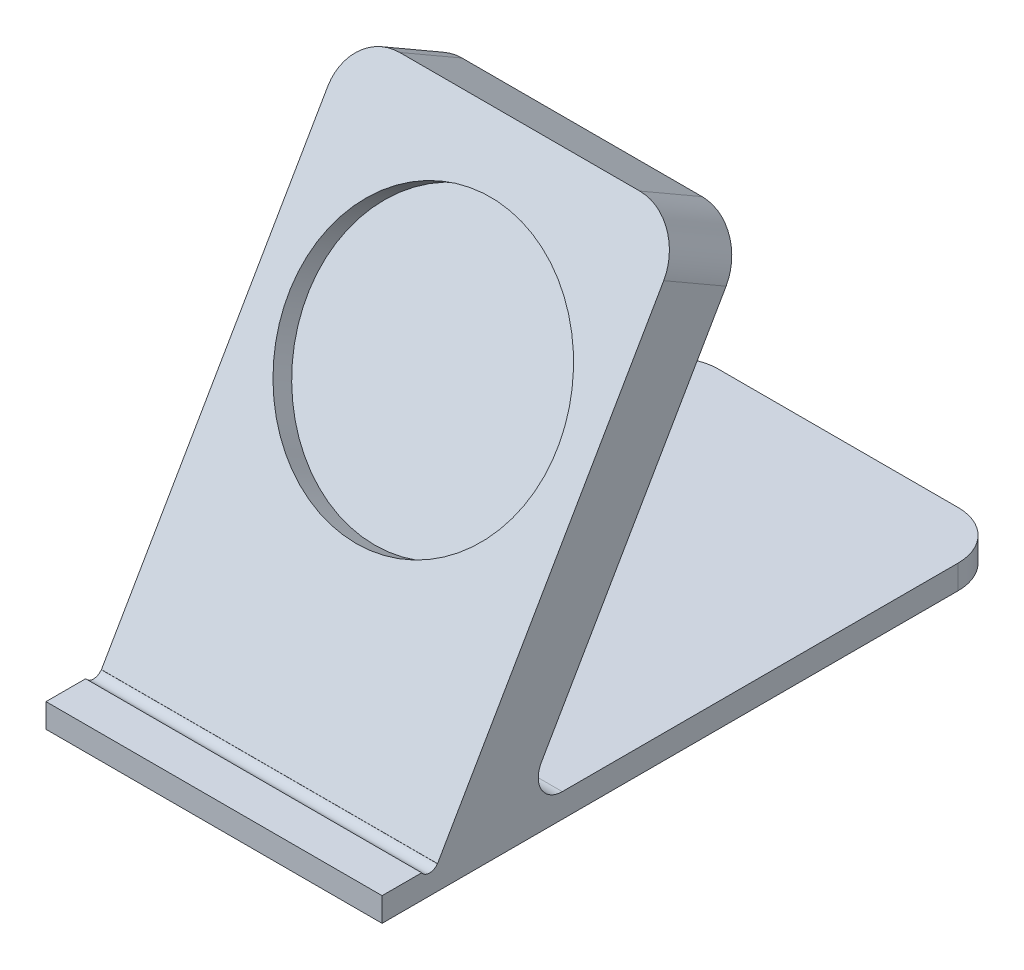
ISO-10303-21;
HEADER;
FILE_DESCRIPTION(('STEP AP214'),'2;1');
FILE_NAME('part.step','',(''),(''),'','','');
FILE_SCHEMA(('AUTOMOTIVE_DESIGN { 1 0 10303 214 1 1 1 1 }'));
ENDSEC;
DATA;
#1=APPLICATION_CONTEXT('core data for automotive mechanical design processes');
#2=APPLICATION_PROTOCOL_DEFINITION('international standard','automotive_design',2000,#1);
#3=PRODUCT_CONTEXT('',#1,'mechanical');
#4=PRODUCT('Part','Part','',(#3));
#5=PRODUCT_RELATED_PRODUCT_CATEGORY('part','',(#4));
#6=PRODUCT_DEFINITION_FORMATION('','',#4);
#7=PRODUCT_DEFINITION_CONTEXT('part definition',#1,'design');
#8=PRODUCT_DEFINITION('design','',#6,#7);
#9=PRODUCT_DEFINITION_SHAPE('','',#8);
#10=(LENGTH_UNIT() NAMED_UNIT(*) SI_UNIT(.MILLI.,.METRE.));
#11=(NAMED_UNIT(*) PLANE_ANGLE_UNIT() SI_UNIT($,.RADIAN.));
#12=(NAMED_UNIT(*) SI_UNIT($,.STERADIAN.) SOLID_ANGLE_UNIT());
#13=UNCERTAINTY_MEASURE_WITH_UNIT(LENGTH_MEASURE(1.E-05),#10,'distance_accuracy_value','');
#14=(GEOMETRIC_REPRESENTATION_CONTEXT(3) GLOBAL_UNCERTAINTY_ASSIGNED_CONTEXT((#13)) GLOBAL_UNIT_ASSIGNED_CONTEXT((#10,
#11,#12)) REPRESENTATION_CONTEXT('',''));
#15=CARTESIAN_POINT('',(0.,0.,0.));
#16=DIRECTION('',(0.,0.,1.));
#17=DIRECTION('',(1.,0.,0.));
#18=AXIS2_PLACEMENT_3D('',#15,#16,#17);
#19=CARTESIAN_POINT('',(-25.,5.,-55.));
#20=DIRECTION('',(0.,1.,0.));
#21=DIRECTION('',(0.,0.,1.));
#22=AXIS2_PLACEMENT_3D('',#19,#20,#21);
#23=PLANE('',#22);
#24=DIRECTION('',(0.,0.,1.));
#25=VECTOR('',#24,1.);
#26=CARTESIAN_POINT('',(-35.,5.,-55.));
#27=LINE('',#26,#25);
#28=CARTESIAN_POINT('',(-35.,5.,-55.));
#29=VERTEX_POINT('',#28);
#30=CARTESIAN_POINT('',(-35.,5.,27.4722325026744));
#31=VERTEX_POINT('',#30);
#32=EDGE_CURVE('E58',#29,#31,#27,.T.);
#33=ORIENTED_EDGE('',*,*,#32,.T.);
#34=DIRECTION('',(1.,0.,0.));
#35=VECTOR('',#34,1.);
#36=CARTESIAN_POINT('',(-46.4564392373896,5.,27.4722325026744));
#37=LINE('',#36,#35);
#38=CARTESIAN_POINT('',(35.,5.,27.4722325026744));
#39=VERTEX_POINT('',#38);
#40=EDGE_CURVE('E53',#31,#39,#37,.T.);
#41=ORIENTED_EDGE('',*,*,#40,.T.);
#42=DIRECTION('',(0.,0.,-1.));
#43=VECTOR('',#42,1.);
#44=CARTESIAN_POINT('',(35.,5.,-55.));
#45=LINE('',#44,#43);
#46=CARTESIAN_POINT('',(35.,5.,-55.));
#47=VERTEX_POINT('',#46);
#48=EDGE_CURVE('E213',#39,#47,#45,.T.);
#49=ORIENTED_EDGE('',*,*,#48,.T.);
#50=CARTESIAN_POINT('',(25.,5.,-55.));
#51=DIRECTION('',(0.,1.,0.));
#52=DIRECTION('',(0.,0.,-1.));
#53=AXIS2_PLACEMENT_3D('',#50,#51,#52);
#54=CIRCLE('',#53,10.);
#55=CARTESIAN_POINT('',(25.,5.,-65.));
#56=VERTEX_POINT('',#55);
#57=EDGE_CURVE('E211',#47,#56,#54,.T.);
#58=ORIENTED_EDGE('',*,*,#57,.T.);
#59=DIRECTION('',(-1.,0.,0.));
#60=VECTOR('',#59,1.);
#61=CARTESIAN_POINT('',(-25.,5.,-65.));
#62=LINE('',#61,#60);
#63=CARTESIAN_POINT('',(-25.,5.,-65.));
#64=VERTEX_POINT('',#63);
#65=EDGE_CURVE('E215',#56,#64,#62,.T.);
#66=ORIENTED_EDGE('',*,*,#65,.T.);
#67=CARTESIAN_POINT('',(-25.,5.,-55.));
#68=DIRECTION('',(0.,1.,0.));
#69=DIRECTION('',(0.,0.,1.));
#70=AXIS2_PLACEMENT_3D('',#67,#68,#69);
#71=CIRCLE('',#70,10.);
#72=EDGE_CURVE('E217',#64,#29,#71,.T.);
#73=ORIENTED_EDGE('',*,*,#72,.T.);
#74=EDGE_LOOP('',(#33,#41,#49,#58,#66,#73));
#75=FACE_BOUND('',#74,.T.);
#76=ADVANCED_FACE('F38',(#75),#23,.T.);
#77=CARTESIAN_POINT('',(0.,16.8958256229942,29.2644284148502));
#78=DIRECTION('',(0.,0.499999999999998,0.86602540378444));
#79=DIRECTION('',(0.,-0.86602540378444,0.499999999999998));
#80=AXIS2_PLACEMENT_3D('',#77,#78,#79);
#81=PLANE('',#80);
#82=DIRECTION('',(1.,0.,0.));
#83=VECTOR('',#82,1.);
#84=CARTESIAN_POINT('',(-46.4564392373896,12.5,31.8023595215966));
#85=LINE('',#84,#83);
#86=CARTESIAN_POINT('',(-35.,12.5,31.8023595215966));
#87=VERTEX_POINT('',#86);
#88=CARTESIAN_POINT('',(35.,12.5,31.8023595215966));
#89=VERTEX_POINT('',#88);
#90=EDGE_CURVE('E155',#87,#89,#85,.T.);
#91=ORIENTED_EDGE('',*,*,#90,.F.);
#92=DIRECTION('',(0.,0.86602540378444,-0.499999999999998));
#93=VECTOR('',#92,1.);
#94=CARTESIAN_POINT('',(-35.,16.8958256229942,29.2644284148502));
#95=LINE('',#94,#93);
#96=CARTESIAN_POINT('',(-35.,79.102540378444,-6.65063509461082));
#97=VERTEX_POINT('',#96);
#98=EDGE_CURVE('E142',#87,#97,#95,.T.);
#99=ORIENTED_EDGE('',*,*,#98,.T.);
#100=CARTESIAN_POINT('',(-25.,79.102540378444,-6.65063509461082));
#101=DIRECTION('',(0.,0.499999999999998,0.86602540378444));
#102=DIRECTION('',(0.,-0.86602540378444,0.499999999999998));
#103=AXIS2_PLACEMENT_3D('',#100,#101,#102);
#104=CIRCLE('',#103,9.99999999999999);
#105=CARTESIAN_POINT('',(-25.,87.7627944162884,-11.6506350946108));
#106=VERTEX_POINT('',#105);
#107=EDGE_CURVE('E152',#97,#106,#104,.F.);
#108=ORIENTED_EDGE('',*,*,#107,.T.);
#109=DIRECTION('',(1.,0.,0.));
#110=VECTOR('',#109,1.);
#111=CARTESIAN_POINT('',(0.,87.7627944162884,-11.6506350946108));
#112=LINE('',#111,#110);
#113=CARTESIAN_POINT('',(25.,87.7627944162884,-11.6506350946108));
#114=VERTEX_POINT('',#113);
#115=EDGE_CURVE('E180',#106,#114,#112,.T.);
#116=ORIENTED_EDGE('',*,*,#115,.T.);
#117=CARTESIAN_POINT('',(25.,79.102540378444,-6.65063509461082));
#118=DIRECTION('',(0.,0.499999999999998,0.86602540378444));
#119=DIRECTION('',(0.,-0.86602540378444,0.499999999999998));
#120=AXIS2_PLACEMENT_3D('',#117,#118,#119);
#121=CIRCLE('',#120,9.99999999999999);
#122=CARTESIAN_POINT('',(35.,79.102540378444,-6.65063509461082));
#123=VERTEX_POINT('',#122);
#124=EDGE_CURVE('E178',#114,#123,#121,.F.);
#125=ORIENTED_EDGE('',*,*,#124,.T.);
#126=DIRECTION('',(0.,0.86602540378444,-0.499999999999998));
#127=VECTOR('',#126,1.);
#128=CARTESIAN_POINT('',(35.,16.8958256229942,29.2644284148502));
#129=LINE('',#128,#127);
#130=EDGE_CURVE('E151',#89,#123,#129,.T.);
#131=ORIENTED_EDGE('',*,*,#130,.F.);
#132=EDGE_LOOP('',(#91,#99,#108,#116,#125,#131));
#133=FACE_BOUND('',#132,.T.);
#134=ADVANCED_FACE('F156',(#133),#81,.F.);
#135=DIRECTION('',(-1.,0.,0.));
#136=VECTOR('',#135,1.);
#137=CARTESIAN_POINT('',(35.,5.,53.4827909336926));
#138=LINE('',#137,#136);
#139=CARTESIAN_POINT('',(35.,5.,53.4827909336926));
#140=VERTEX_POINT('',#139);
#141=CARTESIAN_POINT('',(-35.,5.,53.4827909336926));
#142=VERTEX_POINT('',#141);
#143=EDGE_CURVE('E11',#140,#142,#138,.T.);
#144=ORIENTED_EDGE('',*,*,#143,.F.);
#145=CARTESIAN_POINT('',(35.,5.,53.4529946162075));
#146=VERTEX_POINT('',#145);
#147=EDGE_CURVE('E212',#140,#146,#45,.T.);
#148=ORIENTED_EDGE('',*,*,#147,.T.);
#149=DIRECTION('',(1.,0.,0.));
#150=VECTOR('',#149,1.);
#151=CARTESIAN_POINT('',(-25.,5.,53.4529946162075));
#152=LINE('',#151,#150);
#153=CARTESIAN_POINT('',(-35.,5.,53.4529946162075));
#154=VERTEX_POINT('',#153);
#155=EDGE_CURVE('E198',#154,#146,#152,.T.);
#156=ORIENTED_EDGE('',*,*,#155,.F.);
#157=EDGE_CURVE('E222',#154,#142,#27,.T.);
#158=ORIENTED_EDGE('',*,*,#157,.T.);
#159=EDGE_LOOP('',(#144,#148,#156,#158));
#160=FACE_BOUND('',#159,.T.);
#161=ADVANCED_FACE('F283',(#160),#23,.T.);
#162=CARTESIAN_POINT('',(35.,5.,-55.));
#163=DIRECTION('',(-1.,0.,0.));
#164=DIRECTION('',(0.,0.,1.));
#165=AXIS2_PLACEMENT_3D('',#162,#163,#164);
#166=PLANE('',#165);
#167=ORIENTED_EDGE('',*,*,#48,.F.);
#168=CARTESIAN_POINT('',(35.,10.,27.4722325026744));
#169=DIRECTION('',(1.,0.,0.));
#170=DIRECTION('',(0.,0.,-1.));
#171=AXIS2_PLACEMENT_3D('',#168,#169,#170);
#172=CIRCLE('',#171,5.00000000000001);
#173=EDGE_CURVE('E161',#89,#39,#172,.T.);
#174=ORIENTED_EDGE('',*,*,#173,.F.);
#175=ORIENTED_EDGE('',*,*,#130,.T.);
#176=DIRECTION('',(0.,0.499999999999998,0.86602540378444));
#177=VECTOR('',#176,1.);
#178=CARTESIAN_POINT('',(35.,79.102540378444,-6.65063509461082));
#179=LINE('',#178,#177);
#180=CARTESIAN_POINT('',(35.,86.602540378444,6.33974596215578));
#181=VERTEX_POINT('',#180);
#182=EDGE_CURVE('E195',#123,#181,#179,.T.);
#183=ORIENTED_EDGE('',*,*,#182,.T.);
#184=DIRECTION('',(0.,0.86602540378444,-0.499999999999998));
#185=VECTOR('',#184,1.);
#186=CARTESIAN_POINT('',(35.,24.3958256229942,42.2548094716168));
#187=LINE('',#186,#185);
#188=EDGE_CURVE('E181',#146,#181,#187,.T.);
#189=ORIENTED_EDGE('',*,*,#188,.F.);
#190=ORIENTED_EDGE('',*,*,#147,.F.);
#191=CARTESIAN_POINT('',(35.,6.12356961878438,55.1166984303347));
#192=DIRECTION('',(-1.,0.,0.));
#193=DIRECTION('',(0.,0.,1.));
#194=AXIS2_PLACEMENT_3D('',#191,#192,#193);
#195=CIRCLE('',#194,1.98294286247452);
#196=CARTESIAN_POINT('',(35.,5.,56.7506059269768));
#197=VERTEX_POINT('',#196);
#198=EDGE_CURVE('E166',#140,#197,#195,.T.);
#199=ORIENTED_EDGE('',*,*,#198,.T.);
#200=CARTESIAN_POINT('',(35.,5.,65.));
#201=VERTEX_POINT('',#200);
#202=EDGE_CURVE('E208',#201,#197,#45,.T.);
#203=ORIENTED_EDGE('',*,*,#202,.F.);
#204=DIRECTION('',(0.,-1.,0.));
#205=VECTOR('',#204,1.);
#206=CARTESIAN_POINT('',(35.,5.,65.));
#207=LINE('',#206,#205);
#208=CARTESIAN_POINT('',(35.,0.,65.));
#209=VERTEX_POINT('',#208);
#210=EDGE_CURVE('E224',#201,#209,#207,.T.);
#211=ORIENTED_EDGE('',*,*,#210,.T.);
#212=DIRECTION('',(0.,0.,-1.));
#213=VECTOR('',#212,1.);
#214=CARTESIAN_POINT('',(35.,0.,-55.));
#215=LINE('',#214,#213);
#216=CARTESIAN_POINT('',(35.,0.,-55.));
#217=VERTEX_POINT('',#216);
#218=EDGE_CURVE('E207',#209,#217,#215,.T.);
#219=ORIENTED_EDGE('',*,*,#218,.T.);
#220=DIRECTION('',(0.,-1.,0.));
#221=VECTOR('',#220,1.);
#222=CARTESIAN_POINT('',(35.,5.,-55.));
#223=LINE('',#222,#221);
#224=EDGE_CURVE('E250',#47,#217,#223,.T.);
#225=ORIENTED_EDGE('',*,*,#224,.F.);
#226=EDGE_LOOP('',(#167,#174,#175,#183,#189,#190,#199,#203,#211,#219,#225));
#227=FACE_BOUND('',#226,.T.);
#228=ADVANCED_FACE('F40',(#227),#166,.F.);
#229=CARTESIAN_POINT('',(25.,5.,-55.));
#230=DIRECTION('',(0.,-1.,0.));
#231=DIRECTION('',(0.,0.,-1.));
#232=AXIS2_PLACEMENT_3D('',#229,#230,#231);
#233=CYLINDRICAL_SURFACE('',#232,10.);
#234=CARTESIAN_POINT('',(25.,0.,-55.));
#235=DIRECTION('',(0.,1.,0.));
#236=DIRECTION('',(0.,0.,-1.));
#237=AXIS2_PLACEMENT_3D('',#234,#235,#236);
#238=CIRCLE('',#237,10.);
#239=CARTESIAN_POINT('',(25.,0.,-65.));
#240=VERTEX_POINT('',#239);
#241=EDGE_CURVE('E226',#217,#240,#238,.T.);
#242=ORIENTED_EDGE('',*,*,#241,.T.);
#243=DIRECTION('',(0.,-1.,0.));
#244=VECTOR('',#243,1.);
#245=CARTESIAN_POINT('',(25.,5.,-65.));
#246=LINE('',#245,#244);
#247=EDGE_CURVE('E247',#56,#240,#246,.T.);
#248=ORIENTED_EDGE('',*,*,#247,.F.);
#249=ORIENTED_EDGE('',*,*,#57,.F.);
#250=ORIENTED_EDGE('',*,*,#224,.T.);
#251=EDGE_LOOP('',(#242,#248,#249,#250));
#252=FACE_BOUND('',#251,.T.);
#253=ADVANCED_FACE('F281',(#252),#233,.T.);
#254=CARTESIAN_POINT('',(-25.,5.,-65.));
#255=DIRECTION('',(0.,0.,1.));
#256=DIRECTION('',(1.,0.,0.));
#257=AXIS2_PLACEMENT_3D('',#254,#255,#256);
#258=PLANE('',#257);
#259=DIRECTION('',(-1.,0.,0.));
#260=VECTOR('',#259,1.);
#261=CARTESIAN_POINT('',(-25.,0.,-65.));
#262=LINE('',#261,#260);
#263=CARTESIAN_POINT('',(-25.,0.,-65.));
#264=VERTEX_POINT('',#263);
#265=EDGE_CURVE('E228',#240,#264,#262,.T.);
#266=ORIENTED_EDGE('',*,*,#265,.T.);
#267=DIRECTION('',(0.,-1.,0.));
#268=VECTOR('',#267,1.);
#269=CARTESIAN_POINT('',(-25.,5.,-65.));
#270=LINE('',#269,#268);
#271=EDGE_CURVE('E244',#64,#264,#270,.T.);
#272=ORIENTED_EDGE('',*,*,#271,.F.);
#273=ORIENTED_EDGE('',*,*,#65,.F.);
#274=ORIENTED_EDGE('',*,*,#247,.T.);
#275=EDGE_LOOP('',(#266,#272,#273,#274));
#276=FACE_BOUND('',#275,.T.);
#277=ADVANCED_FACE('F334',(#276),#258,.F.);
#278=CARTESIAN_POINT('',(-25.,5.,-55.));
#279=DIRECTION('',(0.,-1.,0.));
#280=DIRECTION('',(0.,0.,-1.));
#281=AXIS2_PLACEMENT_3D('',#278,#279,#280);
#282=CYLINDRICAL_SURFACE('',#281,10.);
#283=CARTESIAN_POINT('',(-25.,0.,-55.));
#284=DIRECTION('',(0.,1.,0.));
#285=DIRECTION('',(0.,0.,1.));
#286=AXIS2_PLACEMENT_3D('',#283,#284,#285);
#287=CIRCLE('',#286,10.);
#288=CARTESIAN_POINT('',(-35.,0.,-55.));
#289=VERTEX_POINT('',#288);
#290=EDGE_CURVE('E230',#264,#289,#287,.T.);
#291=ORIENTED_EDGE('',*,*,#290,.T.);
#292=DIRECTION('',(0.,-1.,0.));
#293=VECTOR('',#292,1.);
#294=CARTESIAN_POINT('',(-35.,5.,-55.));
#295=LINE('',#294,#293);
#296=EDGE_CURVE('E241',#29,#289,#295,.T.);
#297=ORIENTED_EDGE('',*,*,#296,.F.);
#298=ORIENTED_EDGE('',*,*,#72,.F.);
#299=ORIENTED_EDGE('',*,*,#271,.T.);
#300=EDGE_LOOP('',(#291,#297,#298,#299));
#301=FACE_BOUND('',#300,.T.);
#302=ADVANCED_FACE('F329',(#301),#282,.T.);
#303=CARTESIAN_POINT('',(-35.,5.,-55.));
#304=DIRECTION('',(1.,0.,0.));
#305=DIRECTION('',(0.,0.,-1.));
#306=AXIS2_PLACEMENT_3D('',#303,#304,#305);
#307=PLANE('',#306);
#308=CARTESIAN_POINT('',(-35.,10.,27.4722325026744));
#309=DIRECTION('',(1.,0.,0.));
#310=DIRECTION('',(0.,0.,-1.));
#311=AXIS2_PLACEMENT_3D('',#308,#309,#310);
#312=CIRCLE('',#311,5.00000000000001);
#313=EDGE_CURVE('E146',#31,#87,#312,.F.);
#314=ORIENTED_EDGE('',*,*,#313,.F.);
#315=ORIENTED_EDGE('',*,*,#32,.F.);
#316=ORIENTED_EDGE('',*,*,#296,.T.);
#317=DIRECTION('',(0.,0.,1.));
#318=VECTOR('',#317,1.);
#319=CARTESIAN_POINT('',(-35.,0.,-55.));
#320=LINE('',#319,#318);
#321=CARTESIAN_POINT('',(-35.,0.,65.));
#322=VERTEX_POINT('',#321);
#323=EDGE_CURVE('E232',#289,#322,#320,.T.);
#324=ORIENTED_EDGE('',*,*,#323,.T.);
#325=DIRECTION('',(0.,-1.,0.));
#326=VECTOR('',#325,1.);
#327=CARTESIAN_POINT('',(-35.,5.,65.));
#328=LINE('',#327,#326);
#329=CARTESIAN_POINT('',(-35.,5.,65.));
#330=VERTEX_POINT('',#329);
#331=EDGE_CURVE('E238',#330,#322,#328,.T.);
#332=ORIENTED_EDGE('',*,*,#331,.F.);
#333=CARTESIAN_POINT('',(-35.,5.,56.7506059269768));
#334=VERTEX_POINT('',#333);
#335=EDGE_CURVE('E219',#334,#330,#27,.T.);
#336=ORIENTED_EDGE('',*,*,#335,.F.);
#337=CARTESIAN_POINT('',(-35.,6.12356961878438,55.1166984303347));
#338=DIRECTION('',(-1.,0.,0.));
#339=DIRECTION('',(0.,0.,1.));
#340=AXIS2_PLACEMENT_3D('',#337,#338,#339);
#341=CIRCLE('',#340,1.98294286247452);
#342=EDGE_CURVE('E164',#142,#334,#341,.T.);
#343=ORIENTED_EDGE('',*,*,#342,.F.);
#344=ORIENTED_EDGE('',*,*,#157,.F.);
#345=DIRECTION('',(0.,0.86602540378444,-0.499999999999998));
#346=VECTOR('',#345,1.);
#347=CARTESIAN_POINT('',(-35.,24.3958256229942,42.2548094716168));
#348=LINE('',#347,#346);
#349=CARTESIAN_POINT('',(-35.,86.602540378444,6.33974596215578));
#350=VERTEX_POINT('',#349);
#351=EDGE_CURVE('E192',#154,#350,#348,.T.);
#352=ORIENTED_EDGE('',*,*,#351,.T.);
#353=DIRECTION('',(0.,0.499999999999998,0.86602540378444));
#354=VECTOR('',#353,1.);
#355=CARTESIAN_POINT('',(-35.,79.102540378444,-6.65063509461082));
#356=LINE('',#355,#354);
#357=EDGE_CURVE('E148',#97,#350,#356,.T.);
#358=ORIENTED_EDGE('',*,*,#357,.F.);
#359=ORIENTED_EDGE('',*,*,#98,.F.);
#360=EDGE_LOOP('',(#314,#315,#316,#324,#332,#336,#343,#344,#352,#358,#359));
#361=FACE_BOUND('',#360,.T.);
#362=ADVANCED_FACE('F144',(#361),#307,.F.);
#363=CARTESIAN_POINT('',(-35.,5.,65.));
#364=DIRECTION('',(0.,0.,-1.));
#365=DIRECTION('',(-1.,0.,0.));
#366=AXIS2_PLACEMENT_3D('',#363,#364,#365);
#367=PLANE('',#366);
#368=DIRECTION('',(1.,0.,0.));
#369=VECTOR('',#368,1.);
#370=CARTESIAN_POINT('',(-35.,0.,65.));
#371=LINE('',#370,#369);
#372=EDGE_CURVE('E234',#322,#209,#371,.T.);
#373=ORIENTED_EDGE('',*,*,#372,.T.);
#374=ORIENTED_EDGE('',*,*,#210,.F.);
#375=DIRECTION('',(1.,0.,0.));
#376=VECTOR('',#375,1.);
#377=CARTESIAN_POINT('',(-35.,5.,65.));
#378=LINE('',#377,#376);
#379=EDGE_CURVE('E221',#330,#201,#378,.T.);
#380=ORIENTED_EDGE('',*,*,#379,.F.);
#381=ORIENTED_EDGE('',*,*,#331,.T.);
#382=EDGE_LOOP('',(#373,#374,#380,#381));
#383=FACE_BOUND('',#382,.T.);
#384=ADVANCED_FACE('F268',(#383),#367,.F.);
#385=DIRECTION('',(-1.,0.,0.));
#386=VECTOR('',#385,1.);
#387=CARTESIAN_POINT('',(35.,5.,56.7506059269768));
#388=LINE('',#387,#386);
#389=EDGE_CURVE('E46',#334,#197,#388,.F.);
#390=ORIENTED_EDGE('',*,*,#389,.F.);
#391=ORIENTED_EDGE('',*,*,#335,.T.);
#392=ORIENTED_EDGE('',*,*,#379,.T.);
#393=ORIENTED_EDGE('',*,*,#202,.T.);
#394=EDGE_LOOP('',(#390,#391,#392,#393));
#395=FACE_BOUND('',#394,.T.);
#396=ADVANCED_FACE('F263',(#395),#23,.T.);
#397=CARTESIAN_POINT('',(-25.,0.,-55.));
#398=DIRECTION('',(0.,1.,0.));
#399=DIRECTION('',(0.,0.,1.));
#400=AXIS2_PLACEMENT_3D('',#397,#398,#399);
#401=PLANE('',#400);
#402=ORIENTED_EDGE('',*,*,#372,.F.);
#403=ORIENTED_EDGE('',*,*,#323,.F.);
#404=ORIENTED_EDGE('',*,*,#290,.F.);
#405=ORIENTED_EDGE('',*,*,#265,.F.);
#406=ORIENTED_EDGE('',*,*,#241,.F.);
#407=ORIENTED_EDGE('',*,*,#218,.F.);
#408=EDGE_LOOP('',(#402,#403,#404,#405,#406,#407));
#409=FACE_BOUND('',#408,.T.);
#410=ADVANCED_FACE('F274',(#409),#401,.F.);
#411=CARTESIAN_POINT('',(25.,79.102540378444,-6.65063509461082));
#412=DIRECTION('',(0.,0.499999999999998,0.86602540378444));
#413=DIRECTION('',(0.,-0.86602540378444,0.499999999999998));
#414=AXIS2_PLACEMENT_3D('',#411,#412,#413);
#415=CYLINDRICAL_SURFACE('',#414,9.99999999999999);
#416=CARTESIAN_POINT('',(25.,86.602540378444,6.33974596215578));
#417=DIRECTION('',(0.,0.499999999999998,0.86602540378444));
#418=DIRECTION('',(0.,-0.86602540378444,0.499999999999998));
#419=AXIS2_PLACEMENT_3D('',#416,#417,#418);
#420=CIRCLE('',#419,9.99999999999999);
#421=CARTESIAN_POINT('',(25.,95.2627944162884,1.3397459621558));
#422=VERTEX_POINT('',#421);
#423=EDGE_CURVE('E176',#422,#181,#420,.F.);
#424=ORIENTED_EDGE('',*,*,#423,.T.);
#425=ORIENTED_EDGE('',*,*,#182,.F.);
#426=ORIENTED_EDGE('',*,*,#124,.F.);
#427=DIRECTION('',(0.,0.499999999999998,0.86602540378444));
#428=VECTOR('',#427,1.);
#429=CARTESIAN_POINT('',(25.,87.7627944162884,-11.6506350946108));
#430=LINE('',#429,#428);
#431=EDGE_CURVE('E185',#114,#422,#430,.T.);
#432=ORIENTED_EDGE('',*,*,#431,.T.);
#433=EDGE_LOOP('',(#424,#425,#426,#432));
#434=FACE_BOUND('',#433,.T.);
#435=ADVANCED_FACE('F294',(#434),#415,.T.);
#436=CARTESIAN_POINT('',(-25.,79.102540378444,-6.65063509461082));
#437=DIRECTION('',(0.,0.499999999999998,0.86602540378444));
#438=DIRECTION('',(0.,-0.86602540378444,0.499999999999998));
#439=AXIS2_PLACEMENT_3D('',#436,#437,#438);
#440=CYLINDRICAL_SURFACE('',#439,9.99999999999999);
#441=CARTESIAN_POINT('',(-25.,86.602540378444,6.33974596215578));
#442=DIRECTION('',(0.,0.499999999999998,0.86602540378444));
#443=DIRECTION('',(0.,-0.86602540378444,0.499999999999998));
#444=AXIS2_PLACEMENT_3D('',#441,#442,#443);
#445=CIRCLE('',#444,9.99999999999999);
#446=CARTESIAN_POINT('',(-25.,95.2627944162884,1.3397459621558));
#447=VERTEX_POINT('',#446);
#448=EDGE_CURVE('E190',#350,#447,#445,.F.);
#449=ORIENTED_EDGE('',*,*,#448,.T.);
#450=DIRECTION('',(0.,0.499999999999998,0.86602540378444));
#451=VECTOR('',#450,1.);
#452=CARTESIAN_POINT('',(-25.,87.7627944162884,-11.6506350946108));
#453=LINE('',#452,#451);
#454=EDGE_CURVE('E200',#106,#447,#453,.T.);
#455=ORIENTED_EDGE('',*,*,#454,.F.);
#456=ORIENTED_EDGE('',*,*,#107,.F.);
#457=ORIENTED_EDGE('',*,*,#357,.T.);
#458=EDGE_LOOP('',(#449,#455,#456,#457));
#459=FACE_BOUND('',#458,.T.);
#460=ADVANCED_FACE('F302',(#459),#440,.T.);
#461=CARTESIAN_POINT('',(0.,87.7627944162884,-11.6506350946108));
#462=DIRECTION('',(0.,-0.86602540378444,0.499999999999998));
#463=DIRECTION('',(0.,-0.499999999999998,-0.86602540378444));
#464=AXIS2_PLACEMENT_3D('',#461,#462,#463);
#465=PLANE('',#464);
#466=DIRECTION('',(1.,0.,0.));
#467=VECTOR('',#466,1.);
#468=CARTESIAN_POINT('',(0.,95.2627944162884,1.3397459621558));
#469=LINE('',#468,#467);
#470=EDGE_CURVE('E188',#447,#422,#469,.T.);
#471=ORIENTED_EDGE('',*,*,#470,.T.);
#472=ORIENTED_EDGE('',*,*,#431,.F.);
#473=ORIENTED_EDGE('',*,*,#115,.F.);
#474=ORIENTED_EDGE('',*,*,#454,.T.);
#475=EDGE_LOOP('',(#471,#472,#473,#474));
#476=FACE_BOUND('',#475,.T.);
#477=ADVANCED_FACE('F298',(#476),#465,.F.);
#478=CARTESIAN_POINT('',(0.,24.3958256229942,42.2548094716168));
#479=DIRECTION('',(0.,0.499999999999998,0.86602540378444));
#480=DIRECTION('',(0.,-0.86602540378444,0.499999999999998));
#481=AXIS2_PLACEMENT_3D('',#478,#479,#480);
#482=PLANE('',#481);
#483=CARTESIAN_POINT('',(0.,60.4776710067159,21.4229463264667));
#484=DIRECTION('',(0.,0.499999999999998,0.86602540378444));
#485=DIRECTION('',(0.,-0.86602540378444,0.499999999999998));
#486=AXIS2_PLACEMENT_3D('',#483,#484,#485);
#487=CIRCLE('',#486,28.);
#488=CARTESIAN_POINT('',(0.,36.2289597007516,35.4229463264667));
#489=VERTEX_POINT('',#488);
#490=EDGE_CURVE('E171',#489,#489,#487,.T.);
#491=ORIENTED_EDGE('',*,*,#490,.F.);
#492=EDGE_LOOP('',(#491));
#493=FACE_BOUND('',#492,.T.);
#494=ORIENTED_EDGE('',*,*,#351,.F.);
#495=ORIENTED_EDGE('',*,*,#155,.T.);
#496=ORIENTED_EDGE('',*,*,#188,.T.);
#497=ORIENTED_EDGE('',*,*,#423,.F.);
#498=ORIENTED_EDGE('',*,*,#470,.F.);
#499=ORIENTED_EDGE('',*,*,#448,.F.);
#500=EDGE_LOOP('',(#494,#495,#496,#497,#498,#499));
#501=FACE_BOUND('',#500,.T.);
#502=ADVANCED_FACE('F288',(#493,#501),#482,.T.);
#503=CARTESIAN_POINT('',(35.,6.12356961878438,55.1166984303347));
#504=DIRECTION('',(-1.,0.,0.));
#505=DIRECTION('',(0.,0.,1.));
#506=AXIS2_PLACEMENT_3D('',#503,#504,#505);
#507=CYLINDRICAL_SURFACE('',#506,1.98294286247452);
#508=ORIENTED_EDGE('',*,*,#143,.T.);
#509=ORIENTED_EDGE('',*,*,#342,.T.);
#510=ORIENTED_EDGE('',*,*,#389,.T.);
#511=ORIENTED_EDGE('',*,*,#198,.F.);
#512=EDGE_LOOP('',(#508,#509,#510,#511));
#513=FACE_BOUND('',#512,.T.);
#514=ADVANCED_FACE('F254',(#513),#507,.F.);
#515=CARTESIAN_POINT('',(-46.4564392373896,10.,27.4722325026744));
#516=DIRECTION('',(1.,0.,0.));
#517=DIRECTION('',(0.,0.,-1.));
#518=AXIS2_PLACEMENT_3D('',#515,#516,#517);
#519=CYLINDRICAL_SURFACE('',#518,5.00000000000001);
#520=ORIENTED_EDGE('',*,*,#40,.F.);
#521=ORIENTED_EDGE('',*,*,#313,.T.);
#522=ORIENTED_EDGE('',*,*,#90,.T.);
#523=ORIENTED_EDGE('',*,*,#173,.T.);
#524=EDGE_LOOP('',(#520,#521,#522,#523));
#525=FACE_BOUND('',#524,.T.);
#526=ADVANCED_FACE('F163',(#525),#519,.F.);
#527=CARTESIAN_POINT('',(0.,58.2276710067159,17.5258320094367));
#528=DIRECTION('',(0.,0.499999999999998,0.86602540378444));
#529=DIRECTION('',(0.,-0.86602540378444,0.499999999999998));
#530=AXIS2_PLACEMENT_3D('',#527,#528,#529);
#531=CYLINDRICAL_SURFACE('',#530,28.);
#532=CARTESIAN_POINT('',(0.,58.2276710067159,17.5258320094367));
#533=DIRECTION('',(0.,0.499999999999998,0.86602540378444));
#534=DIRECTION('',(0.,-0.86602540378444,0.499999999999998));
#535=AXIS2_PLACEMENT_3D('',#532,#533,#534);
#536=CIRCLE('',#535,28.);
#537=CARTESIAN_POINT('',(0.,33.9789597007516,31.5258320094367));
#538=VERTEX_POINT('',#537);
#539=EDGE_CURVE('E173',#538,#538,#536,.T.);
#540=ORIENTED_EDGE('',*,*,#539,.F.);
#541=EDGE_LOOP('',(#540));
#542=FACE_BOUND('',#541,.T.);
#543=ORIENTED_EDGE('',*,*,#490,.T.);
#544=EDGE_LOOP('',(#543));
#545=FACE_BOUND('',#544,.T.);
#546=ADVANCED_FACE('F448',(#542,#545),#531,.F.);
#547=CARTESIAN_POINT('',(0.,58.2276710067159,17.5258320094367));
#548=DIRECTION('',(0.,0.499999999999998,0.86602540378444));
#549=DIRECTION('',(0.,-0.86602540378444,0.499999999999998));
#550=AXIS2_PLACEMENT_3D('',#547,#548,#549);
#551=PLANE('',#550);
#552=ORIENTED_EDGE('',*,*,#539,.T.);
#553=EDGE_LOOP('',(#552));
#554=FACE_BOUND('',#553,.T.);
#555=ADVANCED_FACE('F453',(#554),#551,.T.);
#556=CLOSED_SHELL('',(#76,#134,#161,#228,#253,#277,#302,#362,#384,#396,#410,#435,#460,#477,#502,
#514,#526,#546,#555));
#557=MANIFOLD_SOLID_BREP('B2',#556);
#558=ADVANCED_BREP_SHAPE_REPRESENTATION('',(#18,#557),#14);
#559=SHAPE_DEFINITION_REPRESENTATION(#9,#558);
ENDSEC;
END-ISO-10303-21;
